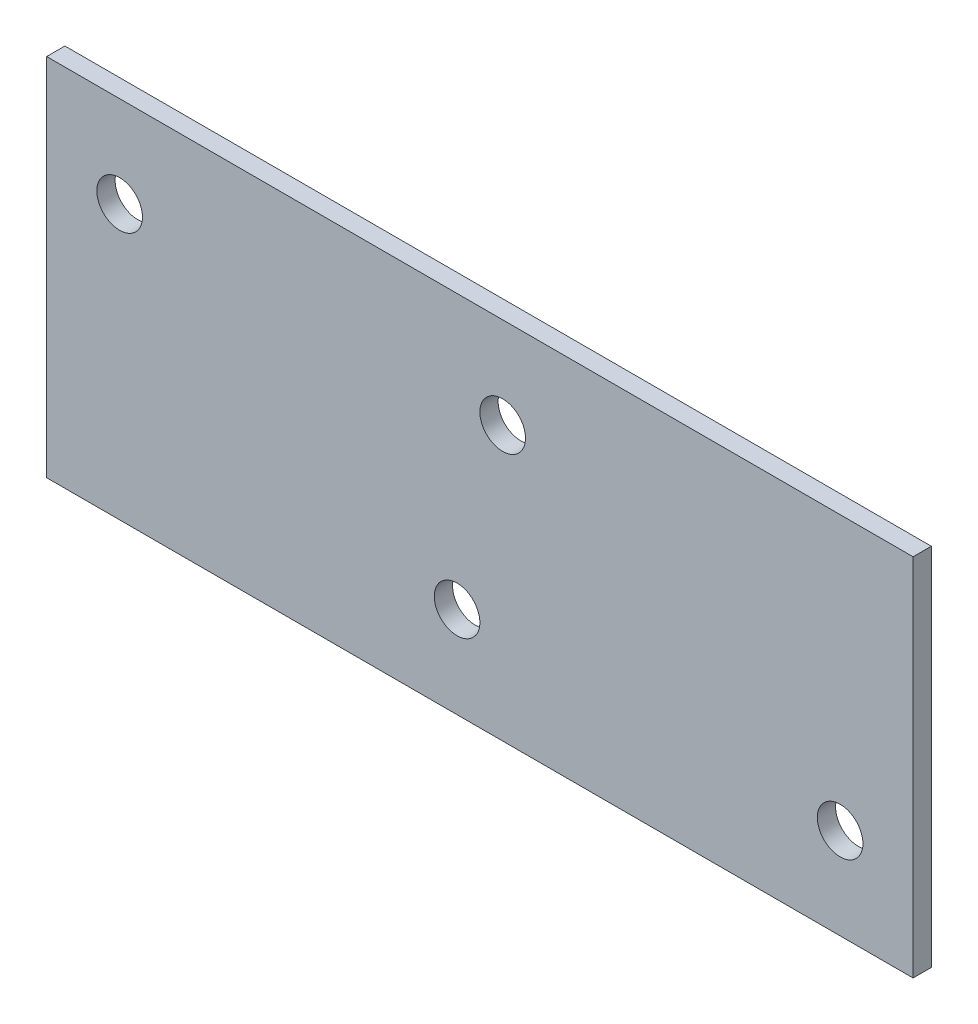
ISO-10303-21;
HEADER;
FILE_DESCRIPTION(('STEP AP214'),'2;1');
FILE_NAME('part.step','',(''),(''),'','','');
FILE_SCHEMA(('AUTOMOTIVE_DESIGN { 1 0 10303 214 1 1 1 1 }'));
ENDSEC;
DATA;
#1=APPLICATION_CONTEXT('core data for automotive mechanical design processes');
#2=APPLICATION_PROTOCOL_DEFINITION('international standard','automotive_design',2000,#1);
#3=PRODUCT_CONTEXT('',#1,'mechanical');
#4=PRODUCT('Part','Part','',(#3));
#5=PRODUCT_RELATED_PRODUCT_CATEGORY('part','',(#4));
#6=PRODUCT_DEFINITION_FORMATION('','',#4);
#7=PRODUCT_DEFINITION_CONTEXT('part definition',#1,'design');
#8=PRODUCT_DEFINITION('design','',#6,#7);
#9=PRODUCT_DEFINITION_SHAPE('','',#8);
#10=(LENGTH_UNIT() NAMED_UNIT(*) SI_UNIT(.MILLI.,.METRE.));
#11=(NAMED_UNIT(*) PLANE_ANGLE_UNIT() SI_UNIT($,.RADIAN.));
#12=(NAMED_UNIT(*) SI_UNIT($,.STERADIAN.) SOLID_ANGLE_UNIT());
#13=UNCERTAINTY_MEASURE_WITH_UNIT(LENGTH_MEASURE(1.E-05),#10,'distance_accuracy_value','');
#14=(GEOMETRIC_REPRESENTATION_CONTEXT(3) GLOBAL_UNCERTAINTY_ASSIGNED_CONTEXT((#13)) GLOBAL_UNIT_ASSIGNED_CONTEXT((#10,
#11,#12)) REPRESENTATION_CONTEXT('',''));
#15=CARTESIAN_POINT('',(0.,0.,0.));
#16=DIRECTION('',(0.,0.,1.));
#17=DIRECTION('',(1.,0.,0.));
#18=AXIS2_PLACEMENT_3D('',#15,#16,#17);
#19=CARTESIAN_POINT('',(0.,0.,2.));
#20=DIRECTION('',(0.,0.,-1.));
#21=DIRECTION('',(-1.,0.,0.));
#22=AXIS2_PLACEMENT_3D('',#19,#20,#21);
#23=PLANE('',#22);
#24=DIRECTION('',(0.,-1.,0.));
#25=VECTOR('',#24,1.);
#26=CARTESIAN_POINT('',(-37.5,20.,2.));
#27=LINE('',#26,#25);
#28=CARTESIAN_POINT('',(-37.5,20.,2.));
#29=VERTEX_POINT('',#28);
#30=CARTESIAN_POINT('',(-37.5,-20.,2.));
#31=VERTEX_POINT('',#30);
#32=EDGE_CURVE('E88',#29,#31,#27,.T.);
#33=ORIENTED_EDGE('',*,*,#32,.T.);
#34=DIRECTION('',(1.,0.,0.));
#35=VECTOR('',#34,1.);
#36=CARTESIAN_POINT('',(57.5,-20.,2.));
#37=LINE('',#36,#35);
#38=CARTESIAN_POINT('',(57.5,-20.,2.));
#39=VERTEX_POINT('',#38);
#40=EDGE_CURVE('E83',#31,#39,#37,.T.);
#41=ORIENTED_EDGE('',*,*,#40,.T.);
#42=DIRECTION('',(0.,1.,0.));
#43=VECTOR('',#42,1.);
#44=CARTESIAN_POINT('',(57.5,20.,2.));
#45=LINE('',#44,#43);
#46=CARTESIAN_POINT('',(57.5,20.,2.));
#47=VERTEX_POINT('',#46);
#48=EDGE_CURVE('E86',#39,#47,#45,.T.);
#49=ORIENTED_EDGE('',*,*,#48,.T.);
#50=DIRECTION('',(-1.,0.,0.));
#51=VECTOR('',#50,1.);
#52=CARTESIAN_POINT('',(57.5,20.,2.));
#53=LINE('',#52,#51);
#54=EDGE_CURVE('E53',#47,#29,#53,.T.);
#55=ORIENTED_EDGE('',*,*,#54,.T.);
#56=EDGE_LOOP('',(#33,#41,#49,#55));
#57=FACE_BOUND('',#56,.T.);
#58=CARTESIAN_POINT('',(-29.5,9.99999999999998,2.));
#59=DIRECTION('',(0.,0.,1.));
#60=DIRECTION('',(1.,0.,0.));
#61=AXIS2_PLACEMENT_3D('',#58,#59,#60);
#62=CIRCLE('',#61,2.49999999999999);
#63=CARTESIAN_POINT('',(-27.,9.99999999999998,2.));
#64=VERTEX_POINT('',#63);
#65=EDGE_CURVE('E103',#64,#64,#62,.T.);
#66=ORIENTED_EDGE('',*,*,#65,.F.);
#67=EDGE_LOOP('',(#66));
#68=FACE_BOUND('',#67,.T.);
#69=CARTESIAN_POINT('',(12.5,9.99999999999998,2.));
#70=DIRECTION('',(0.,0.,1.));
#71=DIRECTION('',(1.,0.,0.));
#72=AXIS2_PLACEMENT_3D('',#69,#70,#71);
#73=CIRCLE('',#72,2.5);
#74=CARTESIAN_POINT('',(15.,9.99999999999998,2.));
#75=VERTEX_POINT('',#74);
#76=EDGE_CURVE('E118',#75,#75,#73,.T.);
#77=ORIENTED_EDGE('',*,*,#76,.F.);
#78=EDGE_LOOP('',(#77));
#79=FACE_BOUND('',#78,.T.);
#80=CARTESIAN_POINT('',(7.5,-9.99999999999999,2.));
#81=DIRECTION('',(0.,0.,1.));
#82=DIRECTION('',(1.,0.,0.));
#83=AXIS2_PLACEMENT_3D('',#80,#81,#82);
#84=CIRCLE('',#83,2.5);
#85=CARTESIAN_POINT('',(10.,-9.99999999999999,2.));
#86=VERTEX_POINT('',#85);
#87=EDGE_CURVE('E124',#86,#86,#84,.T.);
#88=ORIENTED_EDGE('',*,*,#87,.F.);
#89=EDGE_LOOP('',(#88));
#90=FACE_BOUND('',#89,.T.);
#91=CARTESIAN_POINT('',(49.5,-9.99999999999999,2.));
#92=DIRECTION('',(0.,0.,1.));
#93=DIRECTION('',(1.,0.,0.));
#94=AXIS2_PLACEMENT_3D('',#91,#92,#93);
#95=CIRCLE('',#94,2.49999999999999);
#96=CARTESIAN_POINT('',(52.,-9.99999999999999,2.));
#97=VERTEX_POINT('',#96);
#98=EDGE_CURVE('E130',#97,#97,#95,.T.);
#99=ORIENTED_EDGE('',*,*,#98,.F.);
#100=EDGE_LOOP('',(#99));
#101=FACE_BOUND('',#100,.T.);
#102=ADVANCED_FACE('F36',(#57,#68,#79,#90,#101),#23,.F.);
#103=CARTESIAN_POINT('',(0.,0.,0.));
#104=DIRECTION('',(0.,0.,-1.));
#105=DIRECTION('',(-1.,0.,0.));
#106=AXIS2_PLACEMENT_3D('',#103,#104,#105);
#107=PLANE('',#106);
#108=CARTESIAN_POINT('',(7.5,-9.99999999999999,0.));
#109=DIRECTION('',(0.,0.,1.));
#110=DIRECTION('',(1.,0.,0.));
#111=AXIS2_PLACEMENT_3D('',#108,#109,#110);
#112=CIRCLE('',#111,2.5);
#113=CARTESIAN_POINT('',(10.,-9.99999999999999,0.));
#114=VERTEX_POINT('',#113);
#115=EDGE_CURVE('E127',#114,#114,#112,.T.);
#116=ORIENTED_EDGE('',*,*,#115,.T.);
#117=EDGE_LOOP('',(#116));
#118=FACE_BOUND('',#117,.T.);
#119=CARTESIAN_POINT('',(-29.5,9.99999999999998,0.));
#120=DIRECTION('',(0.,0.,1.));
#121=DIRECTION('',(1.,0.,0.));
#122=AXIS2_PLACEMENT_3D('',#119,#120,#121);
#123=CIRCLE('',#122,2.49999999999999);
#124=CARTESIAN_POINT('',(-27.,9.99999999999998,0.));
#125=VERTEX_POINT('',#124);
#126=EDGE_CURVE('E115',#125,#125,#123,.T.);
#127=ORIENTED_EDGE('',*,*,#126,.T.);
#128=EDGE_LOOP('',(#127));
#129=FACE_BOUND('',#128,.T.);
#130=DIRECTION('',(0.,-1.,0.));
#131=VECTOR('',#130,1.);
#132=CARTESIAN_POINT('',(-37.5,20.,0.));
#133=LINE('',#132,#131);
#134=CARTESIAN_POINT('',(-37.5,20.,0.));
#135=VERTEX_POINT('',#134);
#136=CARTESIAN_POINT('',(-37.5,-20.,0.));
#137=VERTEX_POINT('',#136);
#138=EDGE_CURVE('E100',#135,#137,#133,.T.);
#139=ORIENTED_EDGE('',*,*,#138,.F.);
#140=DIRECTION('',(-1.,0.,0.));
#141=VECTOR('',#140,1.);
#142=CARTESIAN_POINT('',(57.5,20.,0.));
#143=LINE('',#142,#141);
#144=CARTESIAN_POINT('',(57.5,20.,0.));
#145=VERTEX_POINT('',#144);
#146=EDGE_CURVE('E76',#145,#135,#143,.T.);
#147=ORIENTED_EDGE('',*,*,#146,.F.);
#148=DIRECTION('',(0.,1.,0.));
#149=VECTOR('',#148,1.);
#150=CARTESIAN_POINT('',(57.5,20.,0.));
#151=LINE('',#150,#149);
#152=CARTESIAN_POINT('',(57.5,-20.,0.));
#153=VERTEX_POINT('',#152);
#154=EDGE_CURVE('E70',#153,#145,#151,.T.);
#155=ORIENTED_EDGE('',*,*,#154,.F.);
#156=DIRECTION('',(1.,0.,0.));
#157=VECTOR('',#156,1.);
#158=CARTESIAN_POINT('',(57.5,-20.,0.));
#159=LINE('',#158,#157);
#160=EDGE_CURVE('E92',#137,#153,#159,.T.);
#161=ORIENTED_EDGE('',*,*,#160,.F.);
#162=EDGE_LOOP('',(#139,#147,#155,#161));
#163=FACE_BOUND('',#162,.T.);
#164=CARTESIAN_POINT('',(12.5,9.99999999999998,0.));
#165=DIRECTION('',(0.,0.,1.));
#166=DIRECTION('',(1.,0.,0.));
#167=AXIS2_PLACEMENT_3D('',#164,#165,#166);
#168=CIRCLE('',#167,2.5);
#169=CARTESIAN_POINT('',(15.,9.99999999999998,0.));
#170=VERTEX_POINT('',#169);
#171=EDGE_CURVE('E121',#170,#170,#168,.T.);
#172=ORIENTED_EDGE('',*,*,#171,.T.);
#173=EDGE_LOOP('',(#172));
#174=FACE_BOUND('',#173,.T.);
#175=CARTESIAN_POINT('',(49.5,-9.99999999999999,0.));
#176=DIRECTION('',(0.,0.,1.));
#177=DIRECTION('',(1.,0.,0.));
#178=AXIS2_PLACEMENT_3D('',#175,#176,#177);
#179=CIRCLE('',#178,2.49999999999999);
#180=CARTESIAN_POINT('',(52.,-9.99999999999999,0.));
#181=VERTEX_POINT('',#180);
#182=EDGE_CURVE('E133',#181,#181,#179,.T.);
#183=ORIENTED_EDGE('',*,*,#182,.T.);
#184=EDGE_LOOP('',(#183));
#185=FACE_BOUND('',#184,.T.);
#186=ADVANCED_FACE('F111',(#118,#129,#163,#174,#185),#107,.T.);
#187=CARTESIAN_POINT('',(-37.5,20.,2.));
#188=DIRECTION('',(1.,0.,0.));
#189=DIRECTION('',(0.,1.,0.));
#190=AXIS2_PLACEMENT_3D('',#187,#188,#189);
#191=PLANE('',#190);
#192=ORIENTED_EDGE('',*,*,#138,.T.);
#193=DIRECTION('',(0.,0.,-1.));
#194=VECTOR('',#193,1.);
#195=CARTESIAN_POINT('',(-37.5,-20.,2.));
#196=LINE('',#195,#194);
#197=EDGE_CURVE('E11',#31,#137,#196,.T.);
#198=ORIENTED_EDGE('',*,*,#197,.F.);
#199=ORIENTED_EDGE('',*,*,#32,.F.);
#200=DIRECTION('',(0.,0.,-1.));
#201=VECTOR('',#200,1.);
#202=CARTESIAN_POINT('',(-37.5,20.,2.));
#203=LINE('',#202,#201);
#204=EDGE_CURVE('E96',#29,#135,#203,.T.);
#205=ORIENTED_EDGE('',*,*,#204,.T.);
#206=EDGE_LOOP('',(#192,#198,#199,#205));
#207=FACE_BOUND('',#206,.T.);
#208=ADVANCED_FACE('F38',(#207),#191,.F.);
#209=CARTESIAN_POINT('',(57.5,-20.,2.));
#210=DIRECTION('',(0.,1.,0.));
#211=DIRECTION('',(-1.,0.,0.));
#212=AXIS2_PLACEMENT_3D('',#209,#210,#211);
#213=PLANE('',#212);
#214=ORIENTED_EDGE('',*,*,#160,.T.);
#215=DIRECTION('',(0.,0.,-1.));
#216=VECTOR('',#215,1.);
#217=CARTESIAN_POINT('',(57.5,-20.,2.));
#218=LINE('',#217,#216);
#219=EDGE_CURVE('E45',#39,#153,#218,.T.);
#220=ORIENTED_EDGE('',*,*,#219,.F.);
#221=ORIENTED_EDGE('',*,*,#40,.F.);
#222=ORIENTED_EDGE('',*,*,#197,.T.);
#223=EDGE_LOOP('',(#214,#220,#221,#222));
#224=FACE_BOUND('',#223,.T.);
#225=ADVANCED_FACE('F91',(#224),#213,.F.);
#226=CARTESIAN_POINT('',(57.5,20.,2.));
#227=DIRECTION('',(-1.,0.,0.));
#228=DIRECTION('',(0.,0.,1.));
#229=AXIS2_PLACEMENT_3D('',#226,#227,#228);
#230=PLANE('',#229);
#231=ORIENTED_EDGE('',*,*,#154,.T.);
#232=DIRECTION('',(0.,0.,-1.));
#233=VECTOR('',#232,1.);
#234=CARTESIAN_POINT('',(57.5,20.,2.));
#235=LINE('',#234,#233);
#236=EDGE_CURVE('E93',#47,#145,#235,.T.);
#237=ORIENTED_EDGE('',*,*,#236,.F.);
#238=ORIENTED_EDGE('',*,*,#48,.F.);
#239=ORIENTED_EDGE('',*,*,#219,.T.);
#240=EDGE_LOOP('',(#231,#237,#238,#239));
#241=FACE_BOUND('',#240,.T.);
#242=ADVANCED_FACE('F94',(#241),#230,.F.);
#243=CARTESIAN_POINT('',(57.5,20.,2.));
#244=DIRECTION('',(0.,-1.,0.));
#245=DIRECTION('',(1.,0.,0.));
#246=AXIS2_PLACEMENT_3D('',#243,#244,#245);
#247=PLANE('',#246);
#248=ORIENTED_EDGE('',*,*,#146,.T.);
#249=ORIENTED_EDGE('',*,*,#204,.F.);
#250=ORIENTED_EDGE('',*,*,#54,.F.);
#251=ORIENTED_EDGE('',*,*,#236,.T.);
#252=EDGE_LOOP('',(#248,#249,#250,#251));
#253=FACE_BOUND('',#252,.T.);
#254=ADVANCED_FACE('F108',(#253),#247,.F.);
#255=CARTESIAN_POINT('',(-29.5,9.99999999999998,2.));
#256=DIRECTION('',(0.,0.,-1.));
#257=DIRECTION('',(-1.,0.,0.));
#258=AXIS2_PLACEMENT_3D('',#255,#256,#257);
#259=CYLINDRICAL_SURFACE('',#258,2.49999999999999);
#260=ORIENTED_EDGE('',*,*,#65,.T.);
#261=EDGE_LOOP('',(#260));
#262=FACE_BOUND('',#261,.T.);
#263=ORIENTED_EDGE('',*,*,#126,.F.);
#264=EDGE_LOOP('',(#263));
#265=FACE_BOUND('',#264,.T.);
#266=ADVANCED_FACE('F150',(#262,#265),#259,.F.);
#267=CARTESIAN_POINT('',(12.5,9.99999999999998,2.));
#268=DIRECTION('',(0.,0.,-1.));
#269=DIRECTION('',(-1.,0.,0.));
#270=AXIS2_PLACEMENT_3D('',#267,#268,#269);
#271=CYLINDRICAL_SURFACE('',#270,2.5);
#272=ORIENTED_EDGE('',*,*,#76,.T.);
#273=EDGE_LOOP('',(#272));
#274=FACE_BOUND('',#273,.T.);
#275=ORIENTED_EDGE('',*,*,#171,.F.);
#276=EDGE_LOOP('',(#275));
#277=FACE_BOUND('',#276,.T.);
#278=ADVANCED_FACE('F196',(#274,#277),#271,.F.);
#279=CARTESIAN_POINT('',(7.5,-9.99999999999999,2.));
#280=DIRECTION('',(0.,0.,-1.));
#281=DIRECTION('',(-1.,0.,0.));
#282=AXIS2_PLACEMENT_3D('',#279,#280,#281);
#283=CYLINDRICAL_SURFACE('',#282,2.5);
#284=ORIENTED_EDGE('',*,*,#87,.T.);
#285=EDGE_LOOP('',(#284));
#286=FACE_BOUND('',#285,.T.);
#287=ORIENTED_EDGE('',*,*,#115,.F.);
#288=EDGE_LOOP('',(#287));
#289=FACE_BOUND('',#288,.T.);
#290=ADVANCED_FACE('F204',(#286,#289),#283,.F.);
#291=CARTESIAN_POINT('',(49.5,-9.99999999999999,2.));
#292=DIRECTION('',(0.,0.,-1.));
#293=DIRECTION('',(-1.,0.,0.));
#294=AXIS2_PLACEMENT_3D('',#291,#292,#293);
#295=CYLINDRICAL_SURFACE('',#294,2.49999999999999);
#296=ORIENTED_EDGE('',*,*,#98,.T.);
#297=EDGE_LOOP('',(#296));
#298=FACE_BOUND('',#297,.T.);
#299=ORIENTED_EDGE('',*,*,#182,.F.);
#300=EDGE_LOOP('',(#299));
#301=FACE_BOUND('',#300,.T.);
#302=ADVANCED_FACE('F139',(#298,#301),#295,.F.);
#303=CLOSED_SHELL('',(#102,#186,#208,#225,#242,#254,#266,#278,#290,#302));
#304=MANIFOLD_SOLID_BREP('B2',#303);
#305=ADVANCED_BREP_SHAPE_REPRESENTATION('',(#18,#304),#14);
#306=SHAPE_DEFINITION_REPRESENTATION(#9,#305);
ENDSEC;
END-ISO-10303-21;
